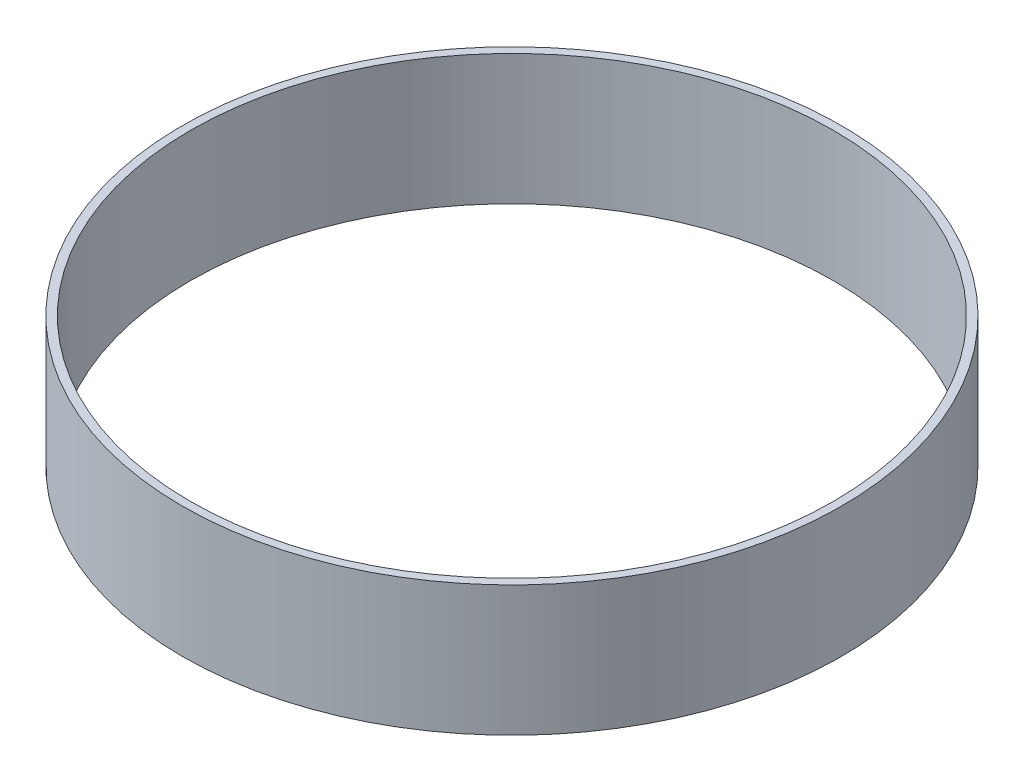
ISO-10303-21;
HEADER;
FILE_DESCRIPTION(('STEP AP214'),'2;1');
FILE_NAME('part.step','',(''),(''),'','','');
FILE_SCHEMA(('AUTOMOTIVE_DESIGN { 1 0 10303 214 1 1 1 1 }'));
ENDSEC;
DATA;
#1=APPLICATION_CONTEXT('core data for automotive mechanical design processes');
#2=APPLICATION_PROTOCOL_DEFINITION('international standard','automotive_design',2000,#1);
#3=PRODUCT_CONTEXT('',#1,'mechanical');
#4=PRODUCT('Part','Part','',(#3));
#5=PRODUCT_RELATED_PRODUCT_CATEGORY('part','',(#4));
#6=PRODUCT_DEFINITION_FORMATION('','',#4);
#7=PRODUCT_DEFINITION_CONTEXT('part definition',#1,'design');
#8=PRODUCT_DEFINITION('design','',#6,#7);
#9=PRODUCT_DEFINITION_SHAPE('','',#8);
#10=(LENGTH_UNIT() NAMED_UNIT(*) SI_UNIT(.MILLI.,.METRE.));
#11=(NAMED_UNIT(*) PLANE_ANGLE_UNIT() SI_UNIT($,.RADIAN.));
#12=(NAMED_UNIT(*) SI_UNIT($,.STERADIAN.) SOLID_ANGLE_UNIT());
#13=UNCERTAINTY_MEASURE_WITH_UNIT(LENGTH_MEASURE(1.E-05),#10,'distance_accuracy_value','');
#14=(GEOMETRIC_REPRESENTATION_CONTEXT(3) GLOBAL_UNCERTAINTY_ASSIGNED_CONTEXT((#13)) GLOBAL_UNIT_ASSIGNED_CONTEXT((#10,
#11,#12)) REPRESENTATION_CONTEXT('',''));
#15=CARTESIAN_POINT('',(0.,0.,0.));
#16=DIRECTION('',(0.,0.,1.));
#17=DIRECTION('',(1.,0.,0.));
#18=AXIS2_PLACEMENT_3D('',#15,#16,#17);
#19=CARTESIAN_POINT('',(0.,16.,0.));
#20=DIRECTION('',(0.,1.,0.));
#21=DIRECTION('',(0.,0.,1.));
#22=AXIS2_PLACEMENT_3D('',#19,#20,#21);
#23=PLANE('',#22);
#24=CARTESIAN_POINT('',(0.,16.,0.));
#25=DIRECTION('',(0.,1.,0.));
#26=DIRECTION('',(0.,0.,1.));
#27=AXIS2_PLACEMENT_3D('',#24,#25,#26);
#28=CIRCLE('',#27,40.5);
#29=CARTESIAN_POINT('',(0.,16.,40.5));
#30=VERTEX_POINT('',#29);
#31=EDGE_CURVE('E10',#30,#30,#28,.T.);
#32=ORIENTED_EDGE('',*,*,#31,.T.);
#33=EDGE_LOOP('',(#32));
#34=FACE_BOUND('',#33,.T.);
#35=CARTESIAN_POINT('',(0.,16.,0.));
#36=DIRECTION('',(0.,1.,0.));
#37=DIRECTION('',(0.,0.,1.));
#38=AXIS2_PLACEMENT_3D('',#35,#36,#37);
#39=CIRCLE('',#38,39.5);
#40=CARTESIAN_POINT('',(0.,16.,39.5));
#41=VERTEX_POINT('',#40);
#42=EDGE_CURVE('E43',#41,#41,#39,.T.);
#43=ORIENTED_EDGE('',*,*,#42,.F.);
#44=EDGE_LOOP('',(#43));
#45=FACE_BOUND('',#44,.T.);
#46=ADVANCED_FACE('F32',(#34,#45),#23,.T.);
#47=CARTESIAN_POINT('',(0.,0.,0.));
#48=DIRECTION('',(0.,1.,0.));
#49=DIRECTION('',(0.,0.,1.));
#50=AXIS2_PLACEMENT_3D('',#47,#48,#49);
#51=PLANE('',#50);
#52=CARTESIAN_POINT('',(0.,0.,0.));
#53=DIRECTION('',(0.,1.,0.));
#54=DIRECTION('',(0.,0.,1.));
#55=AXIS2_PLACEMENT_3D('',#52,#53,#54);
#56=CIRCLE('',#55,40.5);
#57=CARTESIAN_POINT('',(0.,0.,40.5));
#58=VERTEX_POINT('',#57);
#59=EDGE_CURVE('E36',#58,#58,#56,.T.);
#60=ORIENTED_EDGE('',*,*,#59,.F.);
#61=EDGE_LOOP('',(#60));
#62=FACE_BOUND('',#61,.T.);
#63=CARTESIAN_POINT('',(0.,0.,0.));
#64=DIRECTION('',(0.,1.,0.));
#65=DIRECTION('',(0.,0.,1.));
#66=AXIS2_PLACEMENT_3D('',#63,#64,#65);
#67=CIRCLE('',#66,39.5);
#68=CARTESIAN_POINT('',(0.,0.,39.5));
#69=VERTEX_POINT('',#68);
#70=EDGE_CURVE('E45',#69,#69,#67,.T.);
#71=ORIENTED_EDGE('',*,*,#70,.T.);
#72=EDGE_LOOP('',(#71));
#73=FACE_BOUND('',#72,.T.);
#74=ADVANCED_FACE('F55',(#62,#73),#51,.F.);
#75=CARTESIAN_POINT('',(0.,16.,0.));
#76=DIRECTION('',(0.,-1.,0.));
#77=DIRECTION('',(0.,0.,-1.));
#78=AXIS2_PLACEMENT_3D('',#75,#76,#77);
#79=CYLINDRICAL_SURFACE('',#78,40.5);
#80=ORIENTED_EDGE('',*,*,#31,.F.);
#81=EDGE_LOOP('',(#80));
#82=FACE_BOUND('',#81,.T.);
#83=ORIENTED_EDGE('',*,*,#59,.T.);
#84=EDGE_LOOP('',(#83));
#85=FACE_BOUND('',#84,.T.);
#86=ADVANCED_FACE('F34',(#82,#85),#79,.T.);
#87=CARTESIAN_POINT('',(0.,16.,0.));
#88=DIRECTION('',(0.,-1.,0.));
#89=DIRECTION('',(0.,0.,-1.));
#90=AXIS2_PLACEMENT_3D('',#87,#88,#89);
#91=CYLINDRICAL_SURFACE('',#90,39.5);
#92=ORIENTED_EDGE('',*,*,#42,.T.);
#93=EDGE_LOOP('',(#92));
#94=FACE_BOUND('',#93,.T.);
#95=ORIENTED_EDGE('',*,*,#70,.F.);
#96=EDGE_LOOP('',(#95));
#97=FACE_BOUND('',#96,.T.);
#98=ADVANCED_FACE('F51',(#94,#97),#91,.F.);
#99=CLOSED_SHELL('',(#46,#74,#86,#98));
#100=MANIFOLD_SOLID_BREP('B2',#99);
#101=ADVANCED_BREP_SHAPE_REPRESENTATION('',(#18,#100),#14);
#102=SHAPE_DEFINITION_REPRESENTATION(#9,#101);
ENDSEC;
END-ISO-10303-21;
